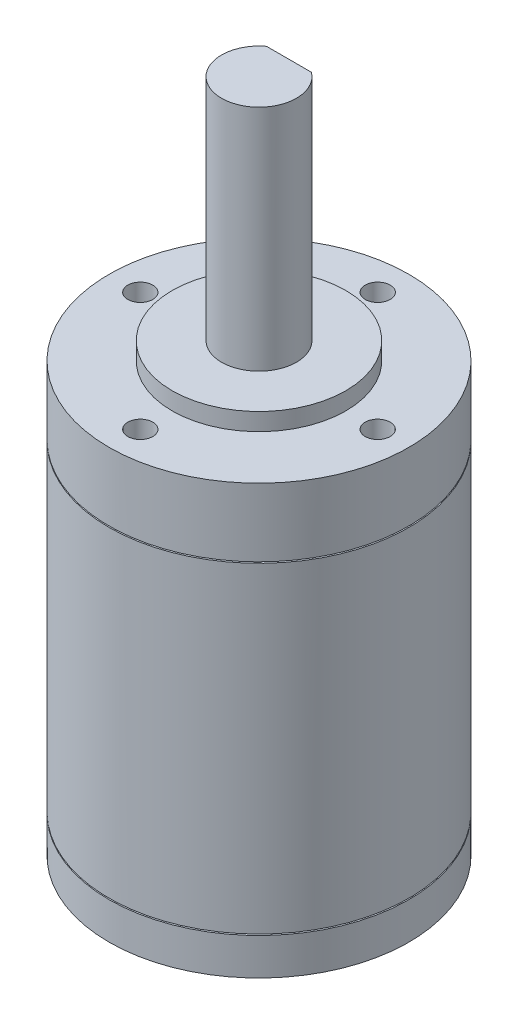
ISO-10303-21;
HEADER;
FILE_DESCRIPTION(('STEP AP214'),'2;1');
FILE_NAME('part.step','',(''),(''),'','','');
FILE_SCHEMA(('AUTOMOTIVE_DESIGN { 1 0 10303 214 1 1 1 1 }'));
ENDSEC;
DATA;
#1=APPLICATION_CONTEXT('core data for automotive mechanical design processes');
#2=APPLICATION_PROTOCOL_DEFINITION('international standard','automotive_design',2000,#1);
#3=PRODUCT_CONTEXT('',#1,'mechanical');
#4=PRODUCT('Part','Part','',(#3));
#5=PRODUCT_RELATED_PRODUCT_CATEGORY('part','',(#4));
#6=PRODUCT_DEFINITION_FORMATION('','',#4);
#7=PRODUCT_DEFINITION_CONTEXT('part definition',#1,'design');
#8=PRODUCT_DEFINITION('design','',#6,#7);
#9=PRODUCT_DEFINITION_SHAPE('','',#8);
#10=(LENGTH_UNIT() NAMED_UNIT(*) SI_UNIT(.MILLI.,.METRE.));
#11=(NAMED_UNIT(*) PLANE_ANGLE_UNIT() SI_UNIT($,.RADIAN.));
#12=(NAMED_UNIT(*) SI_UNIT($,.STERADIAN.) SOLID_ANGLE_UNIT());
#13=UNCERTAINTY_MEASURE_WITH_UNIT(LENGTH_MEASURE(1.E-05),#10,'distance_accuracy_value','');
#14=(GEOMETRIC_REPRESENTATION_CONTEXT(3) GLOBAL_UNCERTAINTY_ASSIGNED_CONTEXT((#13)) GLOBAL_UNIT_ASSIGNED_CONTEXT((#10,
#11,#12)) REPRESENTATION_CONTEXT('',''));
#15=CARTESIAN_POINT('',(0.,0.,0.));
#16=DIRECTION('',(0.,0.,1.));
#17=DIRECTION('',(1.,0.,0.));
#18=AXIS2_PLACEMENT_3D('',#15,#16,#17);
#19=CARTESIAN_POINT('',(0.,34.3,0.));
#20=DIRECTION('',(0.,-1.,0.));
#21=DIRECTION('',(0.,0.,-1.));
#22=AXIS2_PLACEMENT_3D('',#19,#20,#21);
#23=CYLINDRICAL_SURFACE('',#22,12.);
#24=CARTESIAN_POINT('',(0.,0.,0.));
#25=DIRECTION('',(0.,1.,0.));
#26=DIRECTION('',(0.,0.,1.));
#27=AXIS2_PLACEMENT_3D('',#24,#25,#26);
#28=CIRCLE('',#27,12.);
#29=CARTESIAN_POINT('',(0.,0.,12.));
#30=VERTEX_POINT('',#29);
#31=EDGE_CURVE('E213',#30,#30,#28,.T.);
#32=ORIENTED_EDGE('',*,*,#31,.T.);
#33=EDGE_LOOP('',(#32));
#34=FACE_BOUND('',#33,.T.);
#35=CARTESIAN_POINT('',(0.,2.95,0.));
#36=DIRECTION('',(0.,1.,0.));
#37=DIRECTION('',(0.,0.,1.));
#38=AXIS2_PLACEMENT_3D('',#35,#36,#37);
#39=CIRCLE('',#38,12.);
#40=CARTESIAN_POINT('',(0.,2.95,12.));
#41=VERTEX_POINT('',#40);
#42=EDGE_CURVE('E44',#41,#41,#39,.T.);
#43=ORIENTED_EDGE('',*,*,#42,.F.);
#44=EDGE_LOOP('',(#43));
#45=FACE_BOUND('',#44,.T.);
#46=ADVANCED_FACE('F40',(#34,#45),#23,.T.);
#47=CARTESIAN_POINT('',(0.,28.75,0.));
#48=DIRECTION('',(0.,1.,0.));
#49=DIRECTION('',(0.,0.,1.));
#50=AXIS2_PLACEMENT_3D('',#47,#48,#49);
#51=CIRCLE('',#50,12.);
#52=CARTESIAN_POINT('',(0.,28.75,12.));
#53=VERTEX_POINT('',#52);
#54=EDGE_CURVE('E289',#53,#53,#51,.T.);
#55=ORIENTED_EDGE('',*,*,#54,.F.);
#56=EDGE_LOOP('',(#55));
#57=FACE_BOUND('',#56,.T.);
#58=CARTESIAN_POINT('',(0.,3.05,0.));
#59=DIRECTION('',(0.,-1.,0.));
#60=DIRECTION('',(0.,0.,-1.));
#61=AXIS2_PLACEMENT_3D('',#58,#59,#60);
#62=CIRCLE('',#61,12.);
#63=CARTESIAN_POINT('',(0.,3.05,-12.));
#64=VERTEX_POINT('',#63);
#65=EDGE_CURVE('E293',#64,#64,#62,.T.);
#66=ORIENTED_EDGE('',*,*,#65,.F.);
#67=EDGE_LOOP('',(#66));
#68=FACE_BOUND('',#67,.T.);
#69=ADVANCED_FACE('F359',(#57,#68),#23,.T.);
#70=CARTESIAN_POINT('',(0.,34.3,0.));
#71=DIRECTION('',(0.,1.,0.));
#72=DIRECTION('',(0.,0.,1.));
#73=AXIS2_PLACEMENT_3D('',#70,#71,#72);
#74=CIRCLE('',#73,12.);
#75=CARTESIAN_POINT('',(0.,34.3,12.));
#76=VERTEX_POINT('',#75);
#77=EDGE_CURVE('E217',#76,#76,#74,.T.);
#78=ORIENTED_EDGE('',*,*,#77,.F.);
#79=EDGE_LOOP('',(#78));
#80=FACE_BOUND('',#79,.T.);
#81=CARTESIAN_POINT('',(0.,28.85,0.));
#82=DIRECTION('',(0.,-1.,0.));
#83=DIRECTION('',(0.,0.,-1.));
#84=AXIS2_PLACEMENT_3D('',#81,#82,#83);
#85=CIRCLE('',#84,12.);
#86=CARTESIAN_POINT('',(0.,28.85,-12.));
#87=VERTEX_POINT('',#86);
#88=EDGE_CURVE('E285',#87,#87,#85,.T.);
#89=ORIENTED_EDGE('',*,*,#88,.F.);
#90=EDGE_LOOP('',(#89));
#91=FACE_BOUND('',#90,.T.);
#92=ADVANCED_FACE('F362',(#80,#91),#23,.T.);
#93=CARTESIAN_POINT('',(0.,35.7,0.));
#94=DIRECTION('',(0.,1.,0.));
#95=DIRECTION('',(0.,0.,1.));
#96=AXIS2_PLACEMENT_3D('',#93,#94,#95);
#97=PLANE('',#96);
#98=CARTESIAN_POINT('',(0.,35.7,0.));
#99=DIRECTION('',(0.,1.,0.));
#100=DIRECTION('',(0.,0.,1.));
#101=AXIS2_PLACEMENT_3D('',#98,#99,#100);
#102=CIRCLE('',#101,6.95);
#103=CARTESIAN_POINT('',(0.,35.7,6.95));
#104=VERTEX_POINT('',#103);
#105=EDGE_CURVE('E209',#104,#104,#102,.T.);
#106=ORIENTED_EDGE('',*,*,#105,.T.);
#107=EDGE_LOOP('',(#106));
#108=FACE_BOUND('',#107,.T.);
#109=CARTESIAN_POINT('',(0.,35.7,0.));
#110=DIRECTION('',(0.,1.,0.));
#111=DIRECTION('',(0.,0.,1.));
#112=AXIS2_PLACEMENT_3D('',#109,#110,#111);
#113=CIRCLE('',#112,3.);
#114=CARTESIAN_POINT('',(0.,35.7,3.));
#115=VERTEX_POINT('',#114);
#116=EDGE_CURVE('E200',#115,#115,#113,.T.);
#117=ORIENTED_EDGE('',*,*,#116,.F.);
#118=EDGE_LOOP('',(#117));
#119=FACE_BOUND('',#118,.T.);
#120=ADVANCED_FACE('F330',(#108,#119),#97,.T.);
#121=CARTESIAN_POINT('',(0.,34.3,0.));
#122=DIRECTION('',(0.,1.,0.));
#123=DIRECTION('',(0.,0.,1.));
#124=AXIS2_PLACEMENT_3D('',#121,#122,#123);
#125=PLANE('',#124);
#126=CARTESIAN_POINT('',(-9.5,34.3,0.));
#127=DIRECTION('',(0.,1.,0.));
#128=DIRECTION('',(1.,0.,0.));
#129=AXIS2_PLACEMENT_3D('',#126,#127,#128);
#130=CIRCLE('',#129,1.);
#131=CARTESIAN_POINT('',(-8.5,34.3,0.));
#132=VERTEX_POINT('',#131);
#133=EDGE_CURVE('E128',#132,#132,#130,.T.);
#134=ORIENTED_EDGE('',*,*,#133,.F.);
#135=EDGE_LOOP('',(#134));
#136=FACE_BOUND('',#135,.T.);
#137=CARTESIAN_POINT('',(0.,34.3,9.5));
#138=DIRECTION('',(0.,1.,0.));
#139=DIRECTION('',(0.,0.,-1.));
#140=AXIS2_PLACEMENT_3D('',#137,#138,#139);
#141=CIRCLE('',#140,1.);
#142=CARTESIAN_POINT('',(0.,34.3,8.5));
#143=VERTEX_POINT('',#142);
#144=EDGE_CURVE('E137',#143,#143,#141,.T.);
#145=ORIENTED_EDGE('',*,*,#144,.F.);
#146=EDGE_LOOP('',(#145));
#147=FACE_BOUND('',#146,.T.);
#148=CARTESIAN_POINT('',(9.5,34.3,0.));
#149=DIRECTION('',(0.,1.,0.));
#150=DIRECTION('',(-1.,0.,0.));
#151=AXIS2_PLACEMENT_3D('',#148,#149,#150);
#152=CIRCLE('',#151,1.);
#153=CARTESIAN_POINT('',(8.5,34.3,0.));
#154=VERTEX_POINT('',#153);
#155=EDGE_CURVE('E157',#154,#154,#152,.T.);
#156=ORIENTED_EDGE('',*,*,#155,.F.);
#157=EDGE_LOOP('',(#156));
#158=FACE_BOUND('',#157,.T.);
#159=CARTESIAN_POINT('',(0.,34.3,-9.5));
#160=DIRECTION('',(0.,1.,0.));
#161=DIRECTION('',(0.,0.,1.));
#162=AXIS2_PLACEMENT_3D('',#159,#160,#161);
#163=CIRCLE('',#162,1.);
#164=CARTESIAN_POINT('',(0.,34.3,-8.5));
#165=VERTEX_POINT('',#164);
#166=EDGE_CURVE('E172',#165,#165,#163,.T.);
#167=ORIENTED_EDGE('',*,*,#166,.F.);
#168=EDGE_LOOP('',(#167));
#169=FACE_BOUND('',#168,.T.);
#170=ORIENTED_EDGE('',*,*,#77,.T.);
#171=EDGE_LOOP('',(#170));
#172=FACE_BOUND('',#171,.T.);
#173=CARTESIAN_POINT('',(0.,34.3,0.));
#174=DIRECTION('',(0.,1.,0.));
#175=DIRECTION('',(0.,0.,1.));
#176=AXIS2_PLACEMENT_3D('',#173,#174,#175);
#177=CIRCLE('',#176,6.95);
#178=CARTESIAN_POINT('',(0.,34.3,6.95));
#179=VERTEX_POINT('',#178);
#180=EDGE_CURVE('E205',#179,#179,#177,.T.);
#181=ORIENTED_EDGE('',*,*,#180,.F.);
#182=EDGE_LOOP('',(#181));
#183=FACE_BOUND('',#182,.T.);
#184=ADVANCED_FACE('F326',(#136,#147,#158,#169,#172,#183),#125,.T.);
#185=CARTESIAN_POINT('',(0.,0.,0.));
#186=DIRECTION('',(0.,1.,0.));
#187=DIRECTION('',(0.,0.,1.));
#188=AXIS2_PLACEMENT_3D('',#185,#186,#187);
#189=PLANE('',#188);
#190=CARTESIAN_POINT('',(0.,0.,-8.));
#191=DIRECTION('',(0.,-1.,0.));
#192=DIRECTION('',(0.,0.,1.));
#193=AXIS2_PLACEMENT_3D('',#190,#191,#192);
#194=CIRCLE('',#193,1.5);
#195=CARTESIAN_POINT('',(0.,0.,-6.5));
#196=VERTEX_POINT('',#195);
#197=EDGE_CURVE('E284',#196,#196,#194,.T.);
#198=ORIENTED_EDGE('',*,*,#197,.F.);
#199=EDGE_LOOP('',(#198));
#200=FACE_BOUND('',#199,.T.);
#201=CARTESIAN_POINT('',(0.,0.,8.));
#202=DIRECTION('',(0.,-1.,0.));
#203=DIRECTION('',(0.,0.,-1.));
#204=AXIS2_PLACEMENT_3D('',#201,#202,#203);
#205=CIRCLE('',#204,1.5);
#206=CARTESIAN_POINT('',(0.,0.,6.5));
#207=VERTEX_POINT('',#206);
#208=EDGE_CURVE('E279',#207,#207,#205,.T.);
#209=ORIENTED_EDGE('',*,*,#208,.F.);
#210=EDGE_LOOP('',(#209));
#211=FACE_BOUND('',#210,.T.);
#212=CARTESIAN_POINT('',(0.,0.,0.));
#213=DIRECTION('',(0.,1.,0.));
#214=DIRECTION('',(0.,0.,1.));
#215=AXIS2_PLACEMENT_3D('',#212,#213,#214);
#216=CIRCLE('',#215,4.);
#217=CARTESIAN_POINT('',(0.,0.,-4.));
#218=VERTEX_POINT('',#217);
#219=EDGE_CURVE('E245',#218,#218,#216,.T.);
#220=ORIENTED_EDGE('',*,*,#219,.T.);
#221=EDGE_LOOP('',(#220));
#222=FACE_BOUND('',#221,.T.);
#223=ORIENTED_EDGE('',*,*,#31,.F.);
#224=EDGE_LOOP('',(#223));
#225=FACE_BOUND('',#224,.T.);
#226=ADVANCED_FACE('F329',(#200,#211,#222,#225),#189,.F.);
#227=CARTESIAN_POINT('',(0.,35.7,0.));
#228=DIRECTION('',(0.,-1.,0.));
#229=DIRECTION('',(0.,0.,-1.));
#230=AXIS2_PLACEMENT_3D('',#227,#228,#229);
#231=CYLINDRICAL_SURFACE('',#230,6.95);
#232=ORIENTED_EDGE('',*,*,#105,.F.);
#233=EDGE_LOOP('',(#232));
#234=FACE_BOUND('',#233,.T.);
#235=ORIENTED_EDGE('',*,*,#180,.T.);
#236=EDGE_LOOP('',(#235));
#237=FACE_BOUND('',#236,.T.);
#238=ADVANCED_FACE('F342',(#234,#237),#231,.T.);
#239=CARTESIAN_POINT('',(0.,54.,0.));
#240=DIRECTION('',(0.,-1.,0.));
#241=DIRECTION('',(0.,0.,-1.));
#242=AXIS2_PLACEMENT_3D('',#239,#240,#241);
#243=CYLINDRICAL_SURFACE('',#242,3.);
#244=CARTESIAN_POINT('',(0.,54.,0.));
#245=DIRECTION('',(0.,1.,0.));
#246=DIRECTION('',(0.,0.,1.));
#247=AXIS2_PLACEMENT_3D('',#244,#245,#246);
#248=CIRCLE('',#247,3.);
#249=CARTESIAN_POINT('',(-1.8,54.,-2.4));
#250=VERTEX_POINT('',#249);
#251=CARTESIAN_POINT('',(1.8,54.,-2.4));
#252=VERTEX_POINT('',#251);
#253=EDGE_CURVE('E201',#250,#252,#248,.T.);
#254=ORIENTED_EDGE('',*,*,#253,.F.);
#255=DIRECTION('',(0.,-1.,0.));
#256=VECTOR('',#255,1.);
#257=CARTESIAN_POINT('',(-1.8,54.,-2.4));
#258=LINE('',#257,#256);
#259=CARTESIAN_POINT('',(-1.8,39.,-2.4));
#260=VERTEX_POINT('',#259);
#261=EDGE_CURVE('E196',#250,#260,#258,.T.);
#262=ORIENTED_EDGE('',*,*,#261,.T.);
#263=CARTESIAN_POINT('',(0.,39.,0.));
#264=DIRECTION('',(0.,-1.,0.));
#265=DIRECTION('',(0.,0.,-1.));
#266=AXIS2_PLACEMENT_3D('',#263,#264,#265);
#267=CIRCLE('',#266,3.);
#268=CARTESIAN_POINT('',(1.8,39.,-2.4));
#269=VERTEX_POINT('',#268);
#270=EDGE_CURVE('E234',#260,#269,#267,.T.);
#271=ORIENTED_EDGE('',*,*,#270,.T.);
#272=DIRECTION('',(0.,-1.,0.));
#273=VECTOR('',#272,1.);
#274=CARTESIAN_POINT('',(1.8,54.,-2.4));
#275=LINE('',#274,#273);
#276=EDGE_CURVE('E192',#269,#252,#275,.F.);
#277=ORIENTED_EDGE('',*,*,#276,.T.);
#278=EDGE_LOOP('',(#254,#262,#271,#277));
#279=FACE_BOUND('',#278,.T.);
#280=ORIENTED_EDGE('',*,*,#116,.T.);
#281=EDGE_LOOP('',(#280));
#282=FACE_BOUND('',#281,.T.);
#283=ADVANCED_FACE('F344',(#279,#282),#243,.T.);
#284=CARTESIAN_POINT('',(0.,54.,0.));
#285=DIRECTION('',(0.,1.,0.));
#286=DIRECTION('',(0.,0.,1.));
#287=AXIS2_PLACEMENT_3D('',#284,#285,#286);
#288=PLANE('',#287);
#289=DIRECTION('',(1.,0.,0.));
#290=VECTOR('',#289,1.);
#291=CARTESIAN_POINT('',(0.,54.,-2.4));
#292=LINE('',#291,#290);
#293=EDGE_CURVE('E227',#250,#252,#292,.T.);
#294=ORIENTED_EDGE('',*,*,#293,.F.);
#295=ORIENTED_EDGE('',*,*,#253,.T.);
#296=EDGE_LOOP('',(#294,#295));
#297=FACE_BOUND('',#296,.T.);
#298=ADVANCED_FACE('F351',(#297),#288,.T.);
#299=CARTESIAN_POINT('',(0.,39.,0.));
#300=DIRECTION('',(0.,-1.,0.));
#301=DIRECTION('',(0.,0.,-1.));
#302=AXIS2_PLACEMENT_3D('',#299,#300,#301);
#303=PLANE('',#302);
#304=DIRECTION('',(1.,0.,0.));
#305=VECTOR('',#304,1.);
#306=CARTESIAN_POINT('',(-4.18038896908084,39.,-2.4));
#307=LINE('',#306,#305);
#308=EDGE_CURVE('E188',#260,#269,#307,.T.);
#309=ORIENTED_EDGE('',*,*,#308,.T.);
#310=ORIENTED_EDGE('',*,*,#270,.F.);
#311=EDGE_LOOP('',(#309,#310));
#312=FACE_BOUND('',#311,.T.);
#313=ADVANCED_FACE('F437',(#312),#303,.F.);
#314=CARTESIAN_POINT('',(-4.18038896908084,39.,-2.4));
#315=DIRECTION('',(0.,0.,1.));
#316=DIRECTION('',(1.,0.,0.));
#317=AXIS2_PLACEMENT_3D('',#314,#315,#316);
#318=PLANE('',#317);
#319=ORIENTED_EDGE('',*,*,#293,.T.);
#320=ORIENTED_EDGE('',*,*,#276,.F.);
#321=ORIENTED_EDGE('',*,*,#308,.F.);
#322=ORIENTED_EDGE('',*,*,#261,.F.);
#323=EDGE_LOOP('',(#319,#320,#321,#322));
#324=FACE_BOUND('',#323,.T.);
#325=ADVANCED_FACE('F435',(#324),#318,.F.);
#326=CARTESIAN_POINT('',(0.,10.,0.));
#327=DIRECTION('',(0.,-1.,0.));
#328=DIRECTION('',(0.,0.,-1.));
#329=AXIS2_PLACEMENT_3D('',#326,#327,#328);
#330=CYLINDRICAL_SURFACE('',#329,3.1);
#331=CARTESIAN_POINT('',(0.,0.899999999999988,0.));
#332=DIRECTION('',(0.,1.,0.));
#333=DIRECTION('',(0.,0.,1.));
#334=AXIS2_PLACEMENT_3D('',#331,#332,#333);
#335=CIRCLE('',#334,3.1);
#336=CARTESIAN_POINT('',(0.,0.899999999999987,-3.1));
#337=VERTEX_POINT('',#336);
#338=EDGE_CURVE('E238',#337,#337,#335,.F.);
#339=ORIENTED_EDGE('',*,*,#338,.T.);
#340=EDGE_LOOP('',(#339));
#341=FACE_BOUND('',#340,.T.);
#342=CARTESIAN_POINT('',(0.,2.1,0.));
#343=DIRECTION('',(0.,1.,0.));
#344=DIRECTION('',(0.,0.,1.));
#345=AXIS2_PLACEMENT_3D('',#342,#343,#344);
#346=CIRCLE('',#345,3.1);
#347=CARTESIAN_POINT('',(0.,2.1,3.1));
#348=VERTEX_POINT('',#347);
#349=EDGE_CURVE('E187',#348,#348,#346,.T.);
#350=ORIENTED_EDGE('',*,*,#349,.T.);
#351=EDGE_LOOP('',(#350));
#352=FACE_BOUND('',#351,.T.);
#353=ADVANCED_FACE('F432',(#341,#352),#330,.F.);
#354=CARTESIAN_POINT('',(0.,34.3,0.));
#355=DIRECTION('',(0.,-1.,0.));
#356=DIRECTION('',(0.,0.,-1.));
#357=AXIS2_PLACEMENT_3D('',#354,#355,#356);
#358=CYLINDRICAL_SURFACE('',#357,9.9);
#359=DIRECTION('',(0.,1.,0.));
#360=VECTOR('',#359,1.);
#361=CARTESIAN_POINT('',(-9.85578947368421,29.3,-0.934566129503794));
#362=LINE('',#361,#360);
#363=CARTESIAN_POINT('',(-9.8557894736842,24.3,-0.934566129503795));
#364=VERTEX_POINT('',#363);
#365=CARTESIAN_POINT('',(-9.8557894736842,32.2,-0.93456612950379));
#366=VERTEX_POINT('',#365);
#367=EDGE_CURVE('E58',#364,#366,#362,.T.);
#368=ORIENTED_EDGE('',*,*,#367,.F.);
#369=CARTESIAN_POINT('',(0.,24.3,0.));
#370=DIRECTION('',(0.,1.,0.));
#371=DIRECTION('',(0.,0.,1.));
#372=AXIS2_PLACEMENT_3D('',#369,#370,#371);
#373=CIRCLE('',#372,9.9);
#374=CARTESIAN_POINT('',(-9.85578947368422,24.3,0.934566129503588));
#375=VERTEX_POINT('',#374);
#376=EDGE_CURVE('E11',#364,#375,#373,.T.);
#377=ORIENTED_EDGE('',*,*,#376,.T.);
#378=DIRECTION('',(0.,1.,0.));
#379=VECTOR('',#378,1.);
#380=CARTESIAN_POINT('',(-9.85578947368423,29.3,0.934566129503588));
#381=LINE('',#380,#379);
#382=CARTESIAN_POINT('',(-9.85578947368422,32.2,0.934566129503584));
#383=VERTEX_POINT('',#382);
#384=EDGE_CURVE('E126',#383,#375,#381,.F.);
#385=ORIENTED_EDGE('',*,*,#384,.F.);
#386=CARTESIAN_POINT('',(0.,32.2,0.));
#387=DIRECTION('',(0.,1.,0.));
#388=DIRECTION('',(0.,0.,1.));
#389=AXIS2_PLACEMENT_3D('',#386,#387,#388);
#390=CIRCLE('',#389,9.9);
#391=CARTESIAN_POINT('',(-0.934566129503687,32.2,9.85578947368421));
#392=VERTEX_POINT('',#391);
#393=EDGE_CURVE('E66',#383,#392,#390,.T.);
#394=ORIENTED_EDGE('',*,*,#393,.T.);
#395=DIRECTION('',(0.,1.,0.));
#396=VECTOR('',#395,1.);
#397=CARTESIAN_POINT('',(-0.934566129503691,29.3,9.85578947368422));
#398=LINE('',#397,#396);
#399=CARTESIAN_POINT('',(-0.934566129503692,24.3,9.85578947368421));
#400=VERTEX_POINT('',#399);
#401=EDGE_CURVE('E154',#400,#392,#398,.T.);
#402=ORIENTED_EDGE('',*,*,#401,.F.);
#403=CARTESIAN_POINT('',(0.,24.3,0.));
#404=DIRECTION('',(0.,1.,0.));
#405=DIRECTION('',(0.,0.,1.));
#406=AXIS2_PLACEMENT_3D('',#403,#404,#405);
#407=CIRCLE('',#406,9.9);
#408=CARTESIAN_POINT('',(0.934566129503692,24.3,9.85578947368421));
#409=VERTEX_POINT('',#408);
#410=EDGE_CURVE('E269',#400,#409,#407,.T.);
#411=ORIENTED_EDGE('',*,*,#410,.T.);
#412=DIRECTION('',(0.,1.,0.));
#413=VECTOR('',#412,1.);
#414=CARTESIAN_POINT('',(0.934566129503691,29.3,9.85578947368422));
#415=LINE('',#414,#413);
#416=CARTESIAN_POINT('',(0.934566129503687,32.2,9.85578947368421));
#417=VERTEX_POINT('',#416);
#418=EDGE_CURVE('E150',#417,#409,#415,.F.);
#419=ORIENTED_EDGE('',*,*,#418,.F.);
#420=CARTESIAN_POINT('',(9.85578947368421,32.2,0.934566129503721));
#421=VERTEX_POINT('',#420);
#422=EDGE_CURVE('E748',#417,#421,#390,.T.);
#423=ORIENTED_EDGE('',*,*,#422,.T.);
#424=DIRECTION('',(0.,1.,0.));
#425=VECTOR('',#424,1.);
#426=CARTESIAN_POINT('',(9.85578947368421,29.3,0.934566129503725));
#427=LINE('',#426,#425);
#428=CARTESIAN_POINT('',(9.85578947368421,24.3,0.934566129503726));
#429=VERTEX_POINT('',#428);
#430=EDGE_CURVE('E168',#429,#421,#427,.T.);
#431=ORIENTED_EDGE('',*,*,#430,.F.);
#432=CARTESIAN_POINT('',(0.,24.3,0.));
#433=DIRECTION('',(0.,1.,0.));
#434=DIRECTION('',(0.,0.,1.));
#435=AXIS2_PLACEMENT_3D('',#432,#433,#434);
#436=CIRCLE('',#435,9.9);
#437=CARTESIAN_POINT('',(9.85578947368422,24.3,-0.934566129503657));
#438=VERTEX_POINT('',#437);
#439=EDGE_CURVE('E261',#429,#438,#436,.T.);
#440=ORIENTED_EDGE('',*,*,#439,.T.);
#441=DIRECTION('',(0.,1.,0.));
#442=VECTOR('',#441,1.);
#443=CARTESIAN_POINT('',(9.85578947368422,29.3,-0.934566129503657));
#444=LINE('',#443,#442);
#445=CARTESIAN_POINT('',(9.85578947368422,32.2,-0.934566129503652));
#446=VERTEX_POINT('',#445);
#447=EDGE_CURVE('E162',#446,#438,#444,.F.);
#448=ORIENTED_EDGE('',*,*,#447,.F.);
#449=CARTESIAN_POINT('',(0.934566129503687,32.2,-9.85578947368421));
#450=VERTEX_POINT('',#449);
#451=EDGE_CURVE('E228',#446,#450,#390,.T.);
#452=ORIENTED_EDGE('',*,*,#451,.T.);
#453=DIRECTION('',(0.,1.,0.));
#454=VECTOR('',#453,1.);
#455=CARTESIAN_POINT('',(0.934566129503691,29.3,-9.85578947368422));
#456=LINE('',#455,#454);
#457=CARTESIAN_POINT('',(0.934566129503692,24.3,-9.85578947368421));
#458=VERTEX_POINT('',#457);
#459=EDGE_CURVE('E183',#458,#450,#456,.T.);
#460=ORIENTED_EDGE('',*,*,#459,.F.);
#461=CARTESIAN_POINT('',(0.,24.3,0.));
#462=DIRECTION('',(0.,1.,0.));
#463=DIRECTION('',(0.,0.,1.));
#464=AXIS2_PLACEMENT_3D('',#461,#462,#463);
#465=CIRCLE('',#464,9.9);
#466=CARTESIAN_POINT('',(-0.934566129503692,24.3,-9.85578947368421));
#467=VERTEX_POINT('',#466);
#468=EDGE_CURVE('E253',#458,#467,#465,.T.);
#469=ORIENTED_EDGE('',*,*,#468,.T.);
#470=DIRECTION('',(0.,1.,0.));
#471=VECTOR('',#470,1.);
#472=CARTESIAN_POINT('',(-0.934566129503691,29.3,-9.85578947368422));
#473=LINE('',#472,#471);
#474=CARTESIAN_POINT('',(-0.934566129503687,32.2,-9.85578947368421));
#475=VERTEX_POINT('',#474);
#476=EDGE_CURVE('E177',#475,#467,#473,.F.);
#477=ORIENTED_EDGE('',*,*,#476,.F.);
#478=EDGE_CURVE('E135',#475,#366,#390,.T.);
#479=ORIENTED_EDGE('',*,*,#478,.T.);
#480=EDGE_LOOP('',(#368,#377,#385,#394,#402,#411,#419,#423,#431,#440,#448,#452,#460,#469,#477,#479));
#481=FACE_BOUND('',#480,.T.);
#482=CARTESIAN_POINT('',(0.,2.1,0.));
#483=DIRECTION('',(0.,1.,0.));
#484=DIRECTION('',(0.,0.,1.));
#485=AXIS2_PLACEMENT_3D('',#482,#483,#484);
#486=CIRCLE('',#485,9.9);
#487=CARTESIAN_POINT('',(0.,2.1,9.9));
#488=VERTEX_POINT('',#487);
#489=EDGE_CURVE('E221',#488,#488,#486,.T.);
#490=ORIENTED_EDGE('',*,*,#489,.F.);
#491=EDGE_LOOP('',(#490));
#492=FACE_BOUND('',#491,.T.);
#493=ADVANCED_FACE('F131',(#481,#492),#358,.F.);
#494=CARTESIAN_POINT('',(0.,32.2,0.));
#495=DIRECTION('',(0.,1.,0.));
#496=DIRECTION('',(0.,0.,1.));
#497=AXIS2_PLACEMENT_3D('',#494,#495,#496);
#498=PLANE('',#497);
#499=ORIENTED_EDGE('',*,*,#393,.F.);
#500=CARTESIAN_POINT('',(-9.5,32.2,0.));
#501=DIRECTION('',(0.,1.,0.));
#502=DIRECTION('',(0.,0.,1.));
#503=AXIS2_PLACEMENT_3D('',#500,#501,#502);
#504=CIRCLE('',#503,1.);
#505=EDGE_CURVE('E50',#383,#366,#504,.T.);
#506=ORIENTED_EDGE('',*,*,#505,.T.);
#507=ORIENTED_EDGE('',*,*,#478,.F.);
#508=CARTESIAN_POINT('',(0.,32.2,-9.5));
#509=DIRECTION('',(0.,1.,0.));
#510=DIRECTION('',(0.,0.,1.));
#511=AXIS2_PLACEMENT_3D('',#508,#509,#510);
#512=CIRCLE('',#511,1.);
#513=EDGE_CURVE('E249',#475,#450,#512,.T.);
#514=ORIENTED_EDGE('',*,*,#513,.T.);
#515=ORIENTED_EDGE('',*,*,#451,.F.);
#516=CARTESIAN_POINT('',(9.5,32.2,0.));
#517=DIRECTION('',(0.,1.,0.));
#518=DIRECTION('',(0.,0.,1.));
#519=AXIS2_PLACEMENT_3D('',#516,#517,#518);
#520=CIRCLE('',#519,1.);
#521=EDGE_CURVE('E257',#446,#421,#520,.T.);
#522=ORIENTED_EDGE('',*,*,#521,.T.);
#523=ORIENTED_EDGE('',*,*,#422,.F.);
#524=CARTESIAN_POINT('',(0.,32.2,9.5));
#525=DIRECTION('',(0.,1.,0.));
#526=DIRECTION('',(0.,0.,1.));
#527=AXIS2_PLACEMENT_3D('',#524,#525,#526);
#528=CIRCLE('',#527,1.);
#529=EDGE_CURVE('E265',#417,#392,#528,.T.);
#530=ORIENTED_EDGE('',*,*,#529,.T.);
#531=EDGE_LOOP('',(#499,#506,#507,#514,#515,#522,#523,#530));
#532=FACE_BOUND('',#531,.T.);
#533=ADVANCED_FACE('F470',(#532),#498,.F.);
#534=CARTESIAN_POINT('',(0.,2.1,0.));
#535=DIRECTION('',(0.,1.,0.));
#536=DIRECTION('',(0.,0.,1.));
#537=AXIS2_PLACEMENT_3D('',#534,#535,#536);
#538=PLANE('',#537);
#539=CARTESIAN_POINT('',(0.,2.1,-8.));
#540=DIRECTION('',(0.,1.,0.));
#541=DIRECTION('',(0.,0.,1.));
#542=AXIS2_PLACEMENT_3D('',#539,#540,#541);
#543=CIRCLE('',#542,1.5);
#544=CARTESIAN_POINT('',(0.,2.1,-6.5));
#545=VERTEX_POINT('',#544);
#546=EDGE_CURVE('E280',#545,#545,#543,.T.);
#547=ORIENTED_EDGE('',*,*,#546,.F.);
#548=EDGE_LOOP('',(#547));
#549=FACE_BOUND('',#548,.T.);
#550=CARTESIAN_POINT('',(0.,2.1,8.));
#551=DIRECTION('',(0.,1.,0.));
#552=DIRECTION('',(0.,0.,1.));
#553=AXIS2_PLACEMENT_3D('',#550,#551,#552);
#554=CIRCLE('',#553,1.5);
#555=CARTESIAN_POINT('',(0.,2.1,9.5));
#556=VERTEX_POINT('',#555);
#557=EDGE_CURVE('E275',#556,#556,#554,.T.);
#558=ORIENTED_EDGE('',*,*,#557,.F.);
#559=EDGE_LOOP('',(#558));
#560=FACE_BOUND('',#559,.T.);
#561=ORIENTED_EDGE('',*,*,#349,.F.);
#562=EDGE_LOOP('',(#561));
#563=FACE_BOUND('',#562,.T.);
#564=ORIENTED_EDGE('',*,*,#489,.T.);
#565=EDGE_LOOP('',(#564));
#566=FACE_BOUND('',#565,.T.);
#567=ADVANCED_FACE('F475',(#549,#560,#563,#566),#538,.T.);
#568=CARTESIAN_POINT('',(0.,0.899999999999988,0.));
#569=DIRECTION('',(0.,-1.,0.));
#570=DIRECTION('',(0.,0.,-1.));
#571=AXIS2_PLACEMENT_3D('',#568,#569,#570);
#572=CONICAL_SURFACE('',#571,3.1,0.785398163397453);
#573=CARTESIAN_POINT('',(0.,0.,-4.));
#574=CARTESIAN_POINT('',(0.,0.00937499999999998,-3.990625));
#575=CARTESIAN_POINT('',(0.,0.0187499999999998,-3.98125));
#576=CARTESIAN_POINT('',(0.,0.0374999999999994,-3.9625));
#577=CARTESIAN_POINT('',(0.,0.0468749999999992,-3.953125));
#578=CARTESIAN_POINT('',(0.,0.0656249999999989,-3.934375));
#579=CARTESIAN_POINT('',(0.,0.0749999999999989,-3.925));
#580=CARTESIAN_POINT('',(0.,0.0937499999999987,-3.90625));
#581=CARTESIAN_POINT('',(0.,0.103124999999998,-3.896875));
#582=CARTESIAN_POINT('',(0.,0.121874999999998,-3.878125));
#583=CARTESIAN_POINT('',(0.,0.131249999999998,-3.86875));
#584=CARTESIAN_POINT('',(0.,0.149999999999998,-3.85));
#585=CARTESIAN_POINT('',(0.,0.159374999999998,-3.840625));
#586=CARTESIAN_POINT('',(0.,0.178124999999997,-3.821875));
#587=CARTESIAN_POINT('',(0.,0.187499999999997,-3.8125));
#588=CARTESIAN_POINT('',(0.,0.206249999999997,-3.79375));
#589=CARTESIAN_POINT('',(0.,0.215624999999997,-3.784375));
#590=CARTESIAN_POINT('',(0.,0.234374999999997,-3.765625));
#591=CARTESIAN_POINT('',(0.,0.243749999999997,-3.75625));
#592=CARTESIAN_POINT('',(0.,0.262499999999996,-3.7375));
#593=CARTESIAN_POINT('',(0.,0.271874999999996,-3.728125));
#594=CARTESIAN_POINT('',(0.,0.290624999999996,-3.709375));
#595=CARTESIAN_POINT('',(0.,0.299999999999996,-3.7));
#596=CARTESIAN_POINT('',(0.,0.318749999999996,-3.68125));
#597=CARTESIAN_POINT('',(0.,0.328124999999995,-3.671875));
#598=CARTESIAN_POINT('',(0.,0.346874999999995,-3.653125));
#599=CARTESIAN_POINT('',(0.,0.356249999999995,-3.64375));
#600=CARTESIAN_POINT('',(0.,0.374999999999995,-3.625));
#601=CARTESIAN_POINT('',(0.,0.384374999999995,-3.615625));
#602=CARTESIAN_POINT('',(0.,0.403124999999994,-3.596875));
#603=CARTESIAN_POINT('',(0.,0.412499999999994,-3.5875));
#604=CARTESIAN_POINT('',(0.,0.431249999999994,-3.56875));
#605=CARTESIAN_POINT('',(0.,0.440624999999994,-3.559375));
#606=CARTESIAN_POINT('',(0.,0.459374999999994,-3.540625));
#607=CARTESIAN_POINT('',(0.,0.468749999999993,-3.53125));
#608=CARTESIAN_POINT('',(0.,0.487499999999993,-3.5125));
#609=CARTESIAN_POINT('',(0.,0.496874999999993,-3.503125));
#610=CARTESIAN_POINT('',(0.,0.515624999999993,-3.484375));
#611=CARTESIAN_POINT('',(0.,0.524999999999993,-3.475));
#612=CARTESIAN_POINT('',(0.,0.543749999999993,-3.45625));
#613=CARTESIAN_POINT('',(0.,0.553124999999992,-3.446875));
#614=CARTESIAN_POINT('',(0.,0.571874999999992,-3.428125));
#615=CARTESIAN_POINT('',(0.,0.581249999999992,-3.41875));
#616=CARTESIAN_POINT('',(0.,0.599999999999992,-3.4));
#617=CARTESIAN_POINT('',(0.,0.609374999999992,-3.390625));
#618=CARTESIAN_POINT('',(0.,0.628124999999991,-3.371875));
#619=CARTESIAN_POINT('',(0.,0.637499999999991,-3.3625));
#620=CARTESIAN_POINT('',(0.,0.656249999999991,-3.34375));
#621=CARTESIAN_POINT('',(0.,0.665624999999991,-3.334375));
#622=CARTESIAN_POINT('',(0.,0.68437499999999,-3.315625));
#623=CARTESIAN_POINT('',(0.,0.69374999999999,-3.30625));
#624=CARTESIAN_POINT('',(0.,0.71249999999999,-3.2875));
#625=CARTESIAN_POINT('',(0.,0.72187499999999,-3.278125));
#626=CARTESIAN_POINT('',(0.,0.74062499999999,-3.259375));
#627=CARTESIAN_POINT('',(0.,0.74999999999999,-3.25));
#628=CARTESIAN_POINT('',(0.,0.768749999999989,-3.23125));
#629=CARTESIAN_POINT('',(0.,0.778124999999989,-3.221875));
#630=CARTESIAN_POINT('',(0.,0.796874999999989,-3.203125));
#631=CARTESIAN_POINT('',(0.,0.806249999999989,-3.19375));
#632=CARTESIAN_POINT('',(0.,0.824999999999989,-3.175));
#633=CARTESIAN_POINT('',(0.,0.834374999999988,-3.165625));
#634=CARTESIAN_POINT('',(0.,0.853124999999988,-3.146875));
#635=CARTESIAN_POINT('',(0.,0.862499999999988,-3.1375));
#636=CARTESIAN_POINT('',(0.,0.881249999999988,-3.11875));
#637=CARTESIAN_POINT('',(0.,0.890624999999988,-3.109375));
#638=CARTESIAN_POINT('',(0.,0.899999999999987,-3.1));
#639=B_SPLINE_CURVE_WITH_KNOTS('',3,(#573,#574,#575,#576,#577,#578,#579,#580,#581,#582,#583,
#584,#585,#586,#587,#588,#589,#590,#591,#592,#593,#594,#595,#596,#597,#598,#599,#600,#601,#602,
#603,#604,#605,#606,#607,#608,#609,#610,#611,#612,#613,#614,#615,#616,#617,#618,#619,#620,#621,
#622,#623,#624,#625,#626,#627,#628,#629,#630,#631,#632,#633,#634,#635,#636,#637,#638),
.UNSPECIFIED.,.F.,.F.,(4,2,2,2,2,2,2,2,2,2,2,2,2,2,2,2,2,2,2,2,2,2,2,2,2,2,2,2,2,2,2,2,4),(0.,
0.0397747564417427,0.079549512883486,0.119324269325229,0.159099025766972,0.198873782208715,
0.238648538650458,0.278423295092201,0.318198051533943,0.357972807975687,0.397747564417429,
0.437522320859173,0.477297077300915,0.517071833742659,0.556846590184401,0.596621346626144,
0.636396103067887,0.67617085950963,0.715945615951373,0.755720372393116,0.795495128834859,
0.835269885276602,0.875044641718345,0.914819398160088,0.954594154601831,0.994368911043574,
1.03414366748532,1.07391842392706,1.1136931803688,1.15346793681055,1.19324269325229,
1.23301744969403,1.27279220613577),.UNSPECIFIED.);
#640=EDGE_CURVE('BSEAM42',#218,#337,#639,.T.);
#641=ORIENTED_EDGE('',*,*,#219,.F.);
#642=ORIENTED_EDGE('',*,*,#338,.F.);
#643=ORIENTED_EDGE('',*,*,#640,.T.);
#644=ORIENTED_EDGE('',*,*,#640,.F.);
#645=EDGE_LOOP('',(#641,#643,#642,#644));
#646=FACE_BOUND('',#645,.T.);
#647=ADVANCED_FACE('F42',(#646),#572,.F.);
#648=CARTESIAN_POINT('',(0.,24.3,-9.5));
#649=DIRECTION('',(0.,1.,0.));
#650=DIRECTION('',(0.,0.,1.));
#651=AXIS2_PLACEMENT_3D('',#648,#649,#650);
#652=CYLINDRICAL_SURFACE('',#651,1.);
#653=ORIENTED_EDGE('',*,*,#459,.T.);
#654=ORIENTED_EDGE('',*,*,#513,.F.);
#655=ORIENTED_EDGE('',*,*,#476,.T.);
#656=CARTESIAN_POINT('',(0.,24.3,-9.5));
#657=DIRECTION('',(0.,1.,0.));
#658=DIRECTION('',(0.,0.,1.));
#659=AXIS2_PLACEMENT_3D('',#656,#657,#658);
#660=CIRCLE('',#659,1.);
#661=EDGE_CURVE('E173',#458,#467,#660,.T.);
#662=ORIENTED_EDGE('',*,*,#661,.F.);
#663=EDGE_LOOP('',(#653,#654,#655,#662));
#664=FACE_BOUND('',#663,.T.);
#665=ORIENTED_EDGE('',*,*,#166,.T.);
#666=EDGE_LOOP('',(#665));
#667=FACE_BOUND('',#666,.T.);
#668=ADVANCED_FACE('F427',(#664,#667),#652,.F.);
#669=CARTESIAN_POINT('',(0.,24.3,-9.5));
#670=DIRECTION('',(0.,1.,0.));
#671=DIRECTION('',(0.,0.,1.));
#672=AXIS2_PLACEMENT_3D('',#669,#670,#671);
#673=PLANE('',#672);
#674=ORIENTED_EDGE('',*,*,#661,.T.);
#675=ORIENTED_EDGE('',*,*,#468,.F.);
#676=EDGE_LOOP('',(#674,#675));
#677=FACE_BOUND('',#676,.T.);
#678=ADVANCED_FACE('F423',(#677),#673,.T.);
#679=CARTESIAN_POINT('',(9.5,24.3,0.));
#680=DIRECTION('',(0.,1.,0.));
#681=DIRECTION('',(0.,0.,1.));
#682=AXIS2_PLACEMENT_3D('',#679,#680,#681);
#683=CYLINDRICAL_SURFACE('',#682,1.);
#684=ORIENTED_EDGE('',*,*,#430,.T.);
#685=ORIENTED_EDGE('',*,*,#521,.F.);
#686=ORIENTED_EDGE('',*,*,#447,.T.);
#687=CARTESIAN_POINT('',(9.5,24.3,0.));
#688=DIRECTION('',(0.,1.,0.));
#689=DIRECTION('',(-1.,0.,0.));
#690=AXIS2_PLACEMENT_3D('',#687,#688,#689);
#691=CIRCLE('',#690,1.);
#692=EDGE_CURVE('E158',#429,#438,#691,.T.);
#693=ORIENTED_EDGE('',*,*,#692,.F.);
#694=EDGE_LOOP('',(#684,#685,#686,#693));
#695=FACE_BOUND('',#694,.T.);
#696=ORIENTED_EDGE('',*,*,#155,.T.);
#697=EDGE_LOOP('',(#696));
#698=FACE_BOUND('',#697,.T.);
#699=ADVANCED_FACE('F419',(#695,#698),#683,.F.);
#700=CARTESIAN_POINT('',(9.5,24.3,0.));
#701=DIRECTION('',(0.,1.,0.));
#702=DIRECTION('',(-1.,0.,0.));
#703=AXIS2_PLACEMENT_3D('',#700,#701,#702);
#704=PLANE('',#703);
#705=ORIENTED_EDGE('',*,*,#692,.T.);
#706=ORIENTED_EDGE('',*,*,#439,.F.);
#707=EDGE_LOOP('',(#705,#706));
#708=FACE_BOUND('',#707,.T.);
#709=ADVANCED_FACE('F415',(#708),#704,.T.);
#710=CARTESIAN_POINT('',(0.,24.3,9.5));
#711=DIRECTION('',(0.,1.,0.));
#712=DIRECTION('',(0.,0.,1.));
#713=AXIS2_PLACEMENT_3D('',#710,#711,#712);
#714=CYLINDRICAL_SURFACE('',#713,1.);
#715=ORIENTED_EDGE('',*,*,#401,.T.);
#716=ORIENTED_EDGE('',*,*,#529,.F.);
#717=ORIENTED_EDGE('',*,*,#418,.T.);
#718=CARTESIAN_POINT('',(0.,24.3,9.5));
#719=DIRECTION('',(0.,1.,0.));
#720=DIRECTION('',(0.,0.,-1.));
#721=AXIS2_PLACEMENT_3D('',#718,#719,#720);
#722=CIRCLE('',#721,1.);
#723=EDGE_CURVE('E142',#400,#409,#722,.T.);
#724=ORIENTED_EDGE('',*,*,#723,.F.);
#725=EDGE_LOOP('',(#715,#716,#717,#724));
#726=FACE_BOUND('',#725,.T.);
#727=ORIENTED_EDGE('',*,*,#144,.T.);
#728=EDGE_LOOP('',(#727));
#729=FACE_BOUND('',#728,.T.);
#730=ADVANCED_FACE('F411',(#726,#729),#714,.F.);
#731=CARTESIAN_POINT('',(0.,24.3,9.5));
#732=DIRECTION('',(0.,1.,0.));
#733=DIRECTION('',(0.,0.,-1.));
#734=AXIS2_PLACEMENT_3D('',#731,#732,#733);
#735=PLANE('',#734);
#736=ORIENTED_EDGE('',*,*,#723,.T.);
#737=ORIENTED_EDGE('',*,*,#410,.F.);
#738=EDGE_LOOP('',(#736,#737));
#739=FACE_BOUND('',#738,.T.);
#740=ADVANCED_FACE('F408',(#739),#735,.T.);
#741=CARTESIAN_POINT('',(-9.5,24.3,0.));
#742=DIRECTION('',(0.,1.,0.));
#743=DIRECTION('',(0.,0.,1.));
#744=AXIS2_PLACEMENT_3D('',#741,#742,#743);
#745=CYLINDRICAL_SURFACE('',#744,1.);
#746=ORIENTED_EDGE('',*,*,#367,.T.);
#747=ORIENTED_EDGE('',*,*,#505,.F.);
#748=ORIENTED_EDGE('',*,*,#384,.T.);
#749=CARTESIAN_POINT('',(-9.5,24.3,0.));
#750=DIRECTION('',(0.,1.,0.));
#751=DIRECTION('',(1.,0.,0.));
#752=AXIS2_PLACEMENT_3D('',#749,#750,#751);
#753=CIRCLE('',#752,1.);
#754=EDGE_CURVE('E123',#364,#375,#753,.T.);
#755=ORIENTED_EDGE('',*,*,#754,.F.);
#756=EDGE_LOOP('',(#746,#747,#748,#755));
#757=FACE_BOUND('',#756,.T.);
#758=ORIENTED_EDGE('',*,*,#133,.T.);
#759=EDGE_LOOP('',(#758));
#760=FACE_BOUND('',#759,.T.);
#761=ADVANCED_FACE('F124',(#757,#760),#745,.F.);
#762=CARTESIAN_POINT('',(-9.5,24.3,0.));
#763=DIRECTION('',(0.,1.,0.));
#764=DIRECTION('',(1.,0.,0.));
#765=AXIS2_PLACEMENT_3D('',#762,#763,#764);
#766=PLANE('',#765);
#767=ORIENTED_EDGE('',*,*,#754,.T.);
#768=ORIENTED_EDGE('',*,*,#376,.F.);
#769=EDGE_LOOP('',(#767,#768));
#770=FACE_BOUND('',#769,.T.);
#771=ADVANCED_FACE('F122',(#770),#766,.T.);
#772=CARTESIAN_POINT('',(0.,10.,8.));
#773=DIRECTION('',(0.,-1.,0.));
#774=DIRECTION('',(0.,0.,-1.));
#775=AXIS2_PLACEMENT_3D('',#772,#773,#774);
#776=CYLINDRICAL_SURFACE('',#775,1.5);
#777=ORIENTED_EDGE('',*,*,#557,.T.);
#778=EDGE_LOOP('',(#777));
#779=FACE_BOUND('',#778,.T.);
#780=ORIENTED_EDGE('',*,*,#208,.T.);
#781=EDGE_LOOP('',(#780));
#782=FACE_BOUND('',#781,.T.);
#783=ADVANCED_FACE('F399',(#779,#782),#776,.F.);
#784=CARTESIAN_POINT('',(0.,10.,-8.));
#785=DIRECTION('',(0.,-1.,0.));
#786=DIRECTION('',(0.,0.,-1.));
#787=AXIS2_PLACEMENT_3D('',#784,#785,#786);
#788=CYLINDRICAL_SURFACE('',#787,1.5);
#789=ORIENTED_EDGE('',*,*,#546,.T.);
#790=EDGE_LOOP('',(#789));
#791=FACE_BOUND('',#790,.T.);
#792=ORIENTED_EDGE('',*,*,#197,.T.);
#793=EDGE_LOOP('',(#792));
#794=FACE_BOUND('',#793,.T.);
#795=ADVANCED_FACE('F391',(#791,#794),#788,.F.);
#796=CARTESIAN_POINT('',(11.390198226619,28.75,0.));
#797=DIRECTION('',(0.,1.,0.));
#798=DIRECTION('',(0.,0.,1.));
#799=AXIS2_PLACEMENT_3D('',#796,#797,#798);
#800=PLANE('',#799);
#801=CARTESIAN_POINT('',(0.,28.75,0.));
#802=DIRECTION('',(0.,1.,0.));
#803=DIRECTION('',(0.,0.,1.));
#804=AXIS2_PLACEMENT_3D('',#801,#802,#803);
#805=CIRCLE('',#804,11.390198226619);
#806=CARTESIAN_POINT('',(0.,28.75,11.390198226619));
#807=VERTEX_POINT('',#806);
#808=EDGE_CURVE('E290',#807,#807,#805,.T.);
#809=ORIENTED_EDGE('',*,*,#808,.F.);
#810=EDGE_LOOP('',(#809));
#811=FACE_BOUND('',#810,.T.);
#812=ORIENTED_EDGE('',*,*,#54,.T.);
#813=EDGE_LOOP('',(#812));
#814=FACE_BOUND('',#813,.T.);
#815=ADVANCED_FACE('F381',(#811,#814),#800,.T.);
#816=CARTESIAN_POINT('',(11.390198226619,28.85,0.));
#817=DIRECTION('',(0.,-1.,0.));
#818=DIRECTION('',(0.,0.,-1.));
#819=AXIS2_PLACEMENT_3D('',#816,#817,#818);
#820=PLANE('',#819);
#821=CARTESIAN_POINT('',(0.,28.85,0.));
#822=DIRECTION('',(0.,1.,0.));
#823=DIRECTION('',(0.,0.,1.));
#824=AXIS2_PLACEMENT_3D('',#821,#822,#823);
#825=CIRCLE('',#824,11.390198226619);
#826=CARTESIAN_POINT('',(0.,28.85,11.390198226619));
#827=VERTEX_POINT('',#826);
#828=EDGE_CURVE('E301',#827,#827,#825,.T.);
#829=ORIENTED_EDGE('',*,*,#828,.T.);
#830=EDGE_LOOP('',(#829));
#831=FACE_BOUND('',#830,.T.);
#832=ORIENTED_EDGE('',*,*,#88,.T.);
#833=EDGE_LOOP('',(#832));
#834=FACE_BOUND('',#833,.T.);
#835=ADVANCED_FACE('F378',(#831,#834),#820,.T.);
#836=CARTESIAN_POINT('',(0.,62.1821195411436,0.));
#837=DIRECTION('',(0.,1.,0.));
#838=DIRECTION('',(0.,0.,1.));
#839=AXIS2_PLACEMENT_3D('',#836,#837,#838);
#840=CYLINDRICAL_SURFACE('',#839,11.390198226619);
#841=ORIENTED_EDGE('',*,*,#808,.T.);
#842=EDGE_LOOP('',(#841));
#843=FACE_BOUND('',#842,.T.);
#844=ORIENTED_EDGE('',*,*,#828,.F.);
#845=EDGE_LOOP('',(#844));
#846=FACE_BOUND('',#845,.T.);
#847=ADVANCED_FACE('F380',(#843,#846),#840,.T.);
#848=CARTESIAN_POINT('',(11.5,2.95,0.));
#849=DIRECTION('',(0.,1.,0.));
#850=DIRECTION('',(0.,0.,1.));
#851=AXIS2_PLACEMENT_3D('',#848,#849,#850);
#852=PLANE('',#851);
#853=CARTESIAN_POINT('',(0.,2.95,0.));
#854=DIRECTION('',(0.,1.,0.));
#855=DIRECTION('',(0.,0.,1.));
#856=AXIS2_PLACEMENT_3D('',#853,#854,#855);
#857=CIRCLE('',#856,11.5);
#858=CARTESIAN_POINT('',(0.,2.95,11.5));
#859=VERTEX_POINT('',#858);
#860=EDGE_CURVE('E296',#859,#859,#857,.T.);
#861=ORIENTED_EDGE('',*,*,#860,.F.);
#862=EDGE_LOOP('',(#861));
#863=FACE_BOUND('',#862,.T.);
#864=ORIENTED_EDGE('',*,*,#42,.T.);
#865=EDGE_LOOP('',(#864));
#866=FACE_BOUND('',#865,.T.);
#867=ADVANCED_FACE('F388',(#863,#866),#852,.T.);
#868=CARTESIAN_POINT('',(11.5,3.05,0.));
#869=DIRECTION('',(0.,-1.,0.));
#870=DIRECTION('',(0.,0.,-1.));
#871=AXIS2_PLACEMENT_3D('',#868,#869,#870);
#872=PLANE('',#871);
#873=CARTESIAN_POINT('',(0.,3.05,0.));
#874=DIRECTION('',(0.,1.,0.));
#875=DIRECTION('',(0.,0.,1.));
#876=AXIS2_PLACEMENT_3D('',#873,#874,#875);
#877=CIRCLE('',#876,11.5);
#878=CARTESIAN_POINT('',(0.,3.05,11.5));
#879=VERTEX_POINT('',#878);
#880=EDGE_CURVE('E304',#879,#879,#877,.T.);
#881=ORIENTED_EDGE('',*,*,#880,.T.);
#882=EDGE_LOOP('',(#881));
#883=FACE_BOUND('',#882,.T.);
#884=ORIENTED_EDGE('',*,*,#65,.T.);
#885=EDGE_LOOP('',(#884));
#886=FACE_BOUND('',#885,.T.);
#887=ADVANCED_FACE('F536',(#883,#886),#872,.T.);
#888=CARTESIAN_POINT('',(0.,62.1821195411436,0.));
#889=DIRECTION('',(0.,1.,0.));
#890=DIRECTION('',(0.,0.,1.));
#891=AXIS2_PLACEMENT_3D('',#888,#889,#890);
#892=CYLINDRICAL_SURFACE('',#891,11.5);
#893=ORIENTED_EDGE('',*,*,#860,.T.);
#894=EDGE_LOOP('',(#893));
#895=FACE_BOUND('',#894,.T.);
#896=ORIENTED_EDGE('',*,*,#880,.F.);
#897=EDGE_LOOP('',(#896));
#898=FACE_BOUND('',#897,.T.);
#899=ADVANCED_FACE('F544',(#895,#898),#892,.T.);
#900=CLOSED_SHELL('',(#46,#69,#92,#120,#184,#226,#238,#283,#298,#313,#325,#353,#493,#533,#567,
#647,#668,#678,#699,#709,#730,#740,#761,#771,#783,#795,#815,#835,#847,#867,#887,#899));
#901=MANIFOLD_SOLID_BREP('B2',#900);
#902=ADVANCED_BREP_SHAPE_REPRESENTATION('',(#18,#901),#14);
#903=SHAPE_DEFINITION_REPRESENTATION(#9,#902);
ENDSEC;
END-ISO-10303-21;
